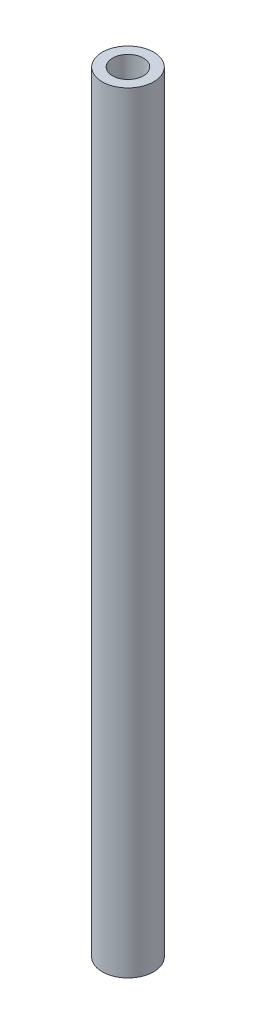
ISO-10303-21;
HEADER;
FILE_DESCRIPTION(('STEP AP214'),'2;1');
FILE_NAME('part.step','',(''),(''),'','','');
FILE_SCHEMA(('AUTOMOTIVE_DESIGN { 1 0 10303 214 1 1 1 1 }'));
ENDSEC;
DATA;
#1=APPLICATION_CONTEXT('core data for automotive mechanical design processes');
#2=APPLICATION_PROTOCOL_DEFINITION('international standard','automotive_design',2000,#1);
#3=PRODUCT_CONTEXT('',#1,'mechanical');
#4=PRODUCT('Part','Part','',(#3));
#5=PRODUCT_RELATED_PRODUCT_CATEGORY('part','',(#4));
#6=PRODUCT_DEFINITION_FORMATION('','',#4);
#7=PRODUCT_DEFINITION_CONTEXT('part definition',#1,'design');
#8=PRODUCT_DEFINITION('design','',#6,#7);
#9=PRODUCT_DEFINITION_SHAPE('','',#8);
#10=(LENGTH_UNIT() NAMED_UNIT(*) SI_UNIT(.MILLI.,.METRE.));
#11=(NAMED_UNIT(*) PLANE_ANGLE_UNIT() SI_UNIT($,.RADIAN.));
#12=(NAMED_UNIT(*) SI_UNIT($,.STERADIAN.) SOLID_ANGLE_UNIT());
#13=UNCERTAINTY_MEASURE_WITH_UNIT(LENGTH_MEASURE(1.E-05),#10,'distance_accuracy_value','');
#14=(GEOMETRIC_REPRESENTATION_CONTEXT(3) GLOBAL_UNCERTAINTY_ASSIGNED_CONTEXT((#13)) GLOBAL_UNIT_ASSIGNED_CONTEXT((#10,
#11,#12)) REPRESENTATION_CONTEXT('',''));
#15=CARTESIAN_POINT('',(0.,0.,0.));
#16=DIRECTION('',(0.,0.,1.));
#17=DIRECTION('',(1.,0.,0.));
#18=AXIS2_PLACEMENT_3D('',#15,#16,#17);
#19=CARTESIAN_POINT('',(0.,75.,0.));
#20=DIRECTION('',(0.,1.,0.));
#21=DIRECTION('',(0.,0.,1.));
#22=AXIS2_PLACEMENT_3D('',#19,#20,#21);
#23=PLANE('',#22);
#24=CARTESIAN_POINT('',(0.,75.,0.));
#25=DIRECTION('',(0.,1.,0.));
#26=DIRECTION('',(0.,0.,1.));
#27=AXIS2_PLACEMENT_3D('',#24,#25,#26);
#28=CIRCLE('',#27,2.5);
#29=CARTESIAN_POINT('',(0.,75.,2.5));
#30=VERTEX_POINT('',#29);
#31=EDGE_CURVE('E10',#30,#30,#28,.T.);
#32=ORIENTED_EDGE('',*,*,#31,.T.);
#33=EDGE_LOOP('',(#32));
#34=FACE_BOUND('',#33,.T.);
#35=CARTESIAN_POINT('',(0.,75.,0.));
#36=DIRECTION('',(0.,1.,0.));
#37=DIRECTION('',(0.,0.,1.));
#38=AXIS2_PLACEMENT_3D('',#35,#36,#37);
#39=CIRCLE('',#38,1.5);
#40=CARTESIAN_POINT('',(0.,75.,1.5));
#41=VERTEX_POINT('',#40);
#42=EDGE_CURVE('E54',#41,#41,#39,.T.);
#43=ORIENTED_EDGE('',*,*,#42,.F.);
#44=EDGE_LOOP('',(#43));
#45=FACE_BOUND('',#44,.T.);
#46=ADVANCED_FACE('F41',(#34,#45),#23,.T.);
#47=CARTESIAN_POINT('',(0.,0.,0.));
#48=DIRECTION('',(0.,1.,0.));
#49=DIRECTION('',(0.,0.,1.));
#50=AXIS2_PLACEMENT_3D('',#47,#48,#49);
#51=PLANE('',#50);
#52=CARTESIAN_POINT('',(0.,0.,0.));
#53=DIRECTION('',(0.,1.,0.));
#54=DIRECTION('',(0.,0.,1.));
#55=AXIS2_PLACEMENT_3D('',#52,#53,#54);
#56=CIRCLE('',#55,2.5);
#57=CARTESIAN_POINT('',(0.,0.,2.5));
#58=VERTEX_POINT('',#57);
#59=EDGE_CURVE('E45',#58,#58,#56,.T.);
#60=ORIENTED_EDGE('',*,*,#59,.F.);
#61=EDGE_LOOP('',(#60));
#62=FACE_BOUND('',#61,.T.);
#63=CARTESIAN_POINT('',(0.,0.,0.));
#64=DIRECTION('',(0.,1.,0.));
#65=DIRECTION('',(0.,0.,1.));
#66=AXIS2_PLACEMENT_3D('',#63,#64,#65);
#67=CIRCLE('',#66,1.5);
#68=CARTESIAN_POINT('',(0.,0.,1.5));
#69=VERTEX_POINT('',#68);
#70=EDGE_CURVE('E56',#69,#69,#67,.T.);
#71=ORIENTED_EDGE('',*,*,#70,.T.);
#72=EDGE_LOOP('',(#71));
#73=FACE_BOUND('',#72,.T.);
#74=ADVANCED_FACE('F68',(#62,#73),#51,.F.);
#75=CARTESIAN_POINT('',(0.,75.,0.));
#76=DIRECTION('',(0.,-1.,0.));
#77=DIRECTION('',(0.,0.,-1.));
#78=AXIS2_PLACEMENT_3D('',#75,#76,#77);
#79=CYLINDRICAL_SURFACE('',#78,2.5);
#80=ORIENTED_EDGE('',*,*,#31,.F.);
#81=EDGE_LOOP('',(#80));
#82=FACE_BOUND('',#81,.T.);
#83=ORIENTED_EDGE('',*,*,#59,.T.);
#84=EDGE_LOOP('',(#83));
#85=FACE_BOUND('',#84,.T.);
#86=ADVANCED_FACE('F43',(#82,#85),#79,.T.);
#87=CARTESIAN_POINT('',(0.,75.,0.));
#88=DIRECTION('',(0.,-1.,0.));
#89=DIRECTION('',(0.,0.,-1.));
#90=AXIS2_PLACEMENT_3D('',#87,#88,#89);
#91=CYLINDRICAL_SURFACE('',#90,1.5);
#92=ORIENTED_EDGE('',*,*,#42,.T.);
#93=EDGE_LOOP('',(#92));
#94=FACE_BOUND('',#93,.T.);
#95=ORIENTED_EDGE('',*,*,#70,.F.);
#96=EDGE_LOOP('',(#95));
#97=FACE_BOUND('',#96,.T.);
#98=ADVANCED_FACE('F64',(#94,#97),#91,.F.);
#99=CLOSED_SHELL('',(#46,#74,#86,#98));
#100=MANIFOLD_SOLID_BREP('B2',#99);
#101=ADVANCED_BREP_SHAPE_REPRESENTATION('',(#18,#100),#14);
#102=SHAPE_DEFINITION_REPRESENTATION(#9,#101);
ENDSEC;
END-ISO-10303-21;
